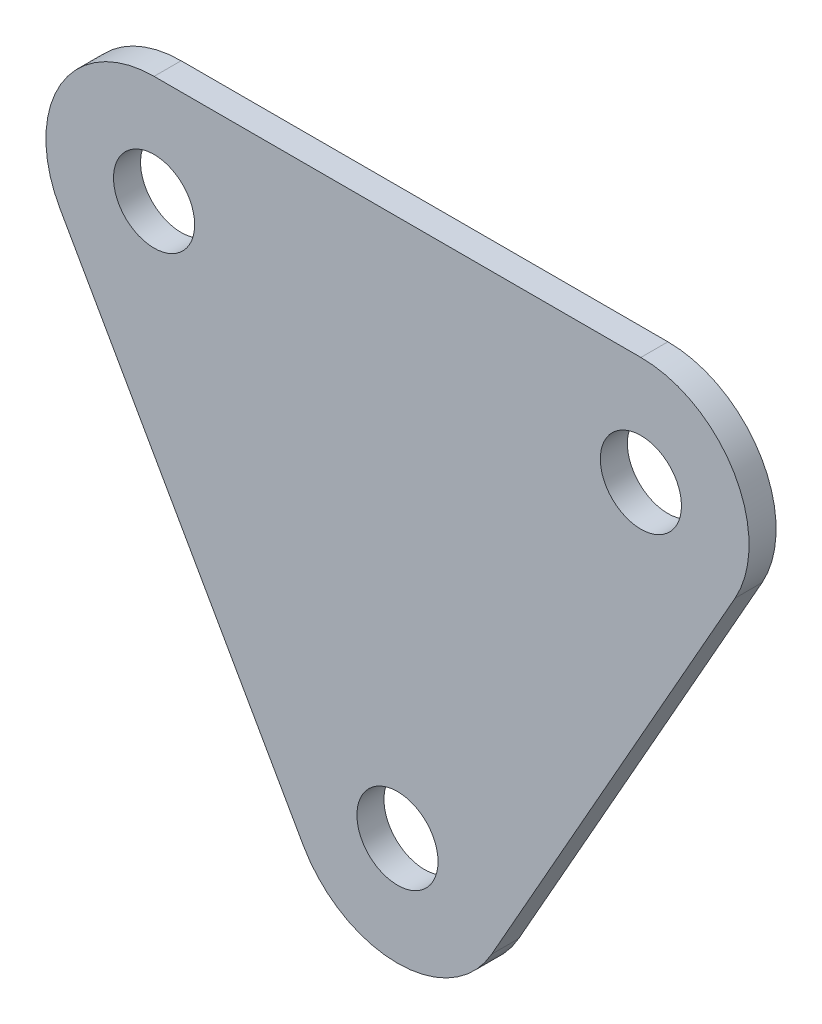
ISO-10303-21;
HEADER;
FILE_DESCRIPTION(('STEP AP214'),'2;1');
FILE_NAME('part.step','',(''),(''),'','','');
FILE_SCHEMA(('AUTOMOTIVE_DESIGN { 1 0 10303 214 1 1 1 1 }'));
ENDSEC;
DATA;
#1=APPLICATION_CONTEXT('core data for automotive mechanical design processes');
#2=APPLICATION_PROTOCOL_DEFINITION('international standard','automotive_design',2000,#1);
#3=PRODUCT_CONTEXT('',#1,'mechanical');
#4=PRODUCT('Part','Part','',(#3));
#5=PRODUCT_RELATED_PRODUCT_CATEGORY('part','',(#4));
#6=PRODUCT_DEFINITION_FORMATION('','',#4);
#7=PRODUCT_DEFINITION_CONTEXT('part definition',#1,'design');
#8=PRODUCT_DEFINITION('design','',#6,#7);
#9=PRODUCT_DEFINITION_SHAPE('','',#8);
#10=(LENGTH_UNIT() NAMED_UNIT(*) SI_UNIT(.MILLI.,.METRE.));
#11=(NAMED_UNIT(*) PLANE_ANGLE_UNIT() SI_UNIT($,.RADIAN.));
#12=(NAMED_UNIT(*) SI_UNIT($,.STERADIAN.) SOLID_ANGLE_UNIT());
#13=UNCERTAINTY_MEASURE_WITH_UNIT(LENGTH_MEASURE(1.E-05),#10,'distance_accuracy_value','');
#14=(GEOMETRIC_REPRESENTATION_CONTEXT(3) GLOBAL_UNCERTAINTY_ASSIGNED_CONTEXT((#13)) GLOBAL_UNIT_ASSIGNED_CONTEXT((#10,
#11,#12)) REPRESENTATION_CONTEXT('',''));
#15=CARTESIAN_POINT('',(0.,0.,0.));
#16=DIRECTION('',(0.,0.,1.));
#17=DIRECTION('',(1.,0.,0.));
#18=AXIS2_PLACEMENT_3D('',#15,#16,#17);
#19=CARTESIAN_POINT('',(180.,-318.,20.));
#20=DIRECTION('',(0.,0.,1.));
#21=DIRECTION('',(1.,0.,0.));
#22=AXIS2_PLACEMENT_3D('',#19,#20,#21);
#23=PLANE('',#22);
#24=CARTESIAN_POINT('',(360.,0.,20.));
#25=DIRECTION('',(0.,0.,1.));
#26=DIRECTION('',(1.,0.,0.));
#27=AXIS2_PLACEMENT_3D('',#24,#25,#26);
#28=CIRCLE('',#27,30.);
#29=CARTESIAN_POINT('',(390.,0.,20.));
#30=VERTEX_POINT('',#29);
#31=EDGE_CURVE('E212',#30,#30,#28,.T.);
#32=ORIENTED_EDGE('',*,*,#31,.F.);
#33=EDGE_LOOP('',(#32));
#34=FACE_BOUND('',#33,.T.);
#35=CARTESIAN_POINT('',(180.,-318.,20.));
#36=DIRECTION('',(0.,0.,1.));
#37=DIRECTION('',(1.,0.,0.));
#38=AXIS2_PLACEMENT_3D('',#35,#36,#37);
#39=CIRCLE('',#38,80.);
#40=CARTESIAN_POINT('',(110.379451594283,-357.407857588142,20.));
#41=VERTEX_POINT('',#40);
#42=CARTESIAN_POINT('',(249.620548405717,-357.407857588142,20.));
#43=VERTEX_POINT('',#42);
#44=EDGE_CURVE('E149',#41,#43,#39,.T.);
#45=ORIENTED_EDGE('',*,*,#44,.T.);
#46=DIRECTION('',(0.49259821985177,0.87025685507146,0.));
#47=VECTOR('',#46,1.);
#48=CARTESIAN_POINT('',(249.620548405717,-357.407857588142,20.));
#49=LINE('',#48,#47);
#50=CARTESIAN_POINT('',(429.620548405717,-39.4078575881416,20.));
#51=VERTEX_POINT('',#50);
#52=EDGE_CURVE('E96',#43,#51,#49,.T.);
#53=ORIENTED_EDGE('',*,*,#52,.T.);
#54=CARTESIAN_POINT('',(360.,0.,20.));
#55=DIRECTION('',(0.,0.,1.));
#56=DIRECTION('',(1.,0.,0.));
#57=AXIS2_PLACEMENT_3D('',#54,#55,#56);
#58=CIRCLE('',#57,80.);
#59=CARTESIAN_POINT('',(360.,80.,20.));
#60=VERTEX_POINT('',#59);
#61=EDGE_CURVE('E109',#51,#60,#58,.T.);
#62=ORIENTED_EDGE('',*,*,#61,.T.);
#63=DIRECTION('',(-1.,0.,0.));
#64=VECTOR('',#63,1.);
#65=CARTESIAN_POINT('',(0.,80.,20.));
#66=LINE('',#65,#64);
#67=CARTESIAN_POINT('',(0.,80.,20.));
#68=VERTEX_POINT('',#67);
#69=EDGE_CURVE('E103',#60,#68,#66,.T.);
#70=ORIENTED_EDGE('',*,*,#69,.T.);
#71=CARTESIAN_POINT('',(0.,0.,20.));
#72=DIRECTION('',(0.,0.,1.));
#73=DIRECTION('',(1.,0.,0.));
#74=AXIS2_PLACEMENT_3D('',#71,#72,#73);
#75=CIRCLE('',#74,80.);
#76=CARTESIAN_POINT('',(-69.6205484057168,-39.4078575881416,20.));
#77=VERTEX_POINT('',#76);
#78=EDGE_CURVE('E107',#68,#77,#75,.T.);
#79=ORIENTED_EDGE('',*,*,#78,.T.);
#80=DIRECTION('',(0.49259821985177,-0.87025685507146,0.));
#81=VECTOR('',#80,1.);
#82=CARTESIAN_POINT('',(110.379451594283,-357.407857588142,20.));
#83=LINE('',#82,#81);
#84=EDGE_CURVE('E59',#77,#41,#83,.T.);
#85=ORIENTED_EDGE('',*,*,#84,.T.);
#86=EDGE_LOOP('',(#45,#53,#62,#70,#79,#85));
#87=FACE_BOUND('',#86,.T.);
#88=CARTESIAN_POINT('',(0.,0.,20.));
#89=DIRECTION('',(0.,0.,1.));
#90=DIRECTION('',(1.,0.,0.));
#91=AXIS2_PLACEMENT_3D('',#88,#89,#90);
#92=CIRCLE('',#91,30.);
#93=CARTESIAN_POINT('',(30.,0.,20.));
#94=VERTEX_POINT('',#93);
#95=EDGE_CURVE('E137',#94,#94,#92,.T.);
#96=ORIENTED_EDGE('',*,*,#95,.F.);
#97=EDGE_LOOP('',(#96));
#98=FACE_BOUND('',#97,.T.);
#99=CARTESIAN_POINT('',(180.,-318.,20.));
#100=DIRECTION('',(0.,0.,1.));
#101=DIRECTION('',(1.,0.,0.));
#102=AXIS2_PLACEMENT_3D('',#99,#100,#101);
#103=CIRCLE('',#102,30.);
#104=CARTESIAN_POINT('',(210.,-318.,20.));
#105=VERTEX_POINT('',#104);
#106=EDGE_CURVE('E200',#105,#105,#103,.T.);
#107=ORIENTED_EDGE('',*,*,#106,.F.);
#108=EDGE_LOOP('',(#107));
#109=FACE_BOUND('',#108,.T.);
#110=ADVANCED_FACE('F41',(#34,#87,#98,#109),#23,.T.);
#111=CARTESIAN_POINT('',(180.,-318.,0.));
#112=DIRECTION('',(0.,0.,1.));
#113=DIRECTION('',(1.,0.,0.));
#114=AXIS2_PLACEMENT_3D('',#111,#112,#113);
#115=PLANE('',#114);
#116=CARTESIAN_POINT('',(180.,-318.,0.));
#117=DIRECTION('',(0.,0.,1.));
#118=DIRECTION('',(1.,0.,0.));
#119=AXIS2_PLACEMENT_3D('',#116,#117,#118);
#120=CIRCLE('',#119,80.);
#121=CARTESIAN_POINT('',(110.379451594283,-357.407857588142,0.));
#122=VERTEX_POINT('',#121);
#123=CARTESIAN_POINT('',(249.620548405717,-357.407857588142,0.));
#124=VERTEX_POINT('',#123);
#125=EDGE_CURVE('E132',#122,#124,#120,.T.);
#126=ORIENTED_EDGE('',*,*,#125,.F.);
#127=DIRECTION('',(0.49259821985177,-0.87025685507146,0.));
#128=VECTOR('',#127,1.);
#129=CARTESIAN_POINT('',(110.379451594283,-357.407857588142,0.));
#130=LINE('',#129,#128);
#131=CARTESIAN_POINT('',(-69.6205484057168,-39.4078575881416,0.));
#132=VERTEX_POINT('',#131);
#133=EDGE_CURVE('E88',#132,#122,#130,.T.);
#134=ORIENTED_EDGE('',*,*,#133,.F.);
#135=CARTESIAN_POINT('',(0.,0.,0.));
#136=DIRECTION('',(0.,0.,1.));
#137=DIRECTION('',(1.,0.,0.));
#138=AXIS2_PLACEMENT_3D('',#135,#136,#137);
#139=CIRCLE('',#138,80.);
#140=CARTESIAN_POINT('',(0.,80.,0.));
#141=VERTEX_POINT('',#140);
#142=EDGE_CURVE('E82',#141,#132,#139,.T.);
#143=ORIENTED_EDGE('',*,*,#142,.F.);
#144=DIRECTION('',(-1.,0.,0.));
#145=VECTOR('',#144,1.);
#146=CARTESIAN_POINT('',(0.,80.,0.));
#147=LINE('',#146,#145);
#148=CARTESIAN_POINT('',(360.,80.,0.));
#149=VERTEX_POINT('',#148);
#150=EDGE_CURVE('E118',#149,#141,#147,.T.);
#151=ORIENTED_EDGE('',*,*,#150,.F.);
#152=CARTESIAN_POINT('',(360.,0.,0.));
#153=DIRECTION('',(0.,0.,1.));
#154=DIRECTION('',(1.,0.,0.));
#155=AXIS2_PLACEMENT_3D('',#152,#153,#154);
#156=CIRCLE('',#155,80.);
#157=CARTESIAN_POINT('',(429.620548405717,-39.4078575881416,0.));
#158=VERTEX_POINT('',#157);
#159=EDGE_CURVE('E140',#158,#149,#156,.T.);
#160=ORIENTED_EDGE('',*,*,#159,.F.);
#161=DIRECTION('',(0.49259821985177,0.87025685507146,0.));
#162=VECTOR('',#161,1.);
#163=CARTESIAN_POINT('',(249.620548405717,-357.407857588142,0.));
#164=LINE('',#163,#162);
#165=EDGE_CURVE('E136',#124,#158,#164,.T.);
#166=ORIENTED_EDGE('',*,*,#165,.F.);
#167=EDGE_LOOP('',(#126,#134,#143,#151,#160,#166));
#168=FACE_BOUND('',#167,.T.);
#169=CARTESIAN_POINT('',(0.,0.,0.));
#170=DIRECTION('',(0.,0.,1.));
#171=DIRECTION('',(1.,0.,0.));
#172=AXIS2_PLACEMENT_3D('',#169,#170,#171);
#173=CIRCLE('',#172,30.);
#174=CARTESIAN_POINT('',(30.,0.,0.));
#175=VERTEX_POINT('',#174);
#176=EDGE_CURVE('E216',#175,#175,#173,.T.);
#177=ORIENTED_EDGE('',*,*,#176,.T.);
#178=EDGE_LOOP('',(#177));
#179=FACE_BOUND('',#178,.T.);
#180=CARTESIAN_POINT('',(360.,0.,0.));
#181=DIRECTION('',(0.,0.,1.));
#182=DIRECTION('',(1.,0.,0.));
#183=AXIS2_PLACEMENT_3D('',#180,#181,#182);
#184=CIRCLE('',#183,30.);
#185=CARTESIAN_POINT('',(390.,0.,0.));
#186=VERTEX_POINT('',#185);
#187=EDGE_CURVE('E209',#186,#186,#184,.T.);
#188=ORIENTED_EDGE('',*,*,#187,.T.);
#189=EDGE_LOOP('',(#188));
#190=FACE_BOUND('',#189,.T.);
#191=CARTESIAN_POINT('',(180.,-318.,0.));
#192=DIRECTION('',(0.,0.,1.));
#193=DIRECTION('',(1.,0.,0.));
#194=AXIS2_PLACEMENT_3D('',#191,#192,#193);
#195=CIRCLE('',#194,30.);
#196=CARTESIAN_POINT('',(210.,-318.,0.));
#197=VERTEX_POINT('',#196);
#198=EDGE_CURVE('E203',#197,#197,#195,.T.);
#199=ORIENTED_EDGE('',*,*,#198,.T.);
#200=EDGE_LOOP('',(#199));
#201=FACE_BOUND('',#200,.T.);
#202=ADVANCED_FACE('F163',(#168,#179,#190,#201),#115,.F.);
#203=CARTESIAN_POINT('',(180.,-318.,20.));
#204=DIRECTION('',(0.,0.,-1.));
#205=DIRECTION('',(-1.,0.,0.));
#206=AXIS2_PLACEMENT_3D('',#203,#204,#205);
#207=CYLINDRICAL_SURFACE('',#206,80.);
#208=ORIENTED_EDGE('',*,*,#125,.T.);
#209=DIRECTION('',(0.,0.,-1.));
#210=VECTOR('',#209,1.);
#211=CARTESIAN_POINT('',(249.620548405717,-357.407857588142,20.));
#212=LINE('',#211,#210);
#213=EDGE_CURVE('E11',#43,#124,#212,.T.);
#214=ORIENTED_EDGE('',*,*,#213,.F.);
#215=ORIENTED_EDGE('',*,*,#44,.F.);
#216=DIRECTION('',(0.,0.,-1.));
#217=VECTOR('',#216,1.);
#218=CARTESIAN_POINT('',(110.379451594283,-357.407857588142,20.));
#219=LINE('',#218,#217);
#220=EDGE_CURVE('E128',#41,#122,#219,.T.);
#221=ORIENTED_EDGE('',*,*,#220,.T.);
#222=EDGE_LOOP('',(#208,#214,#215,#221));
#223=FACE_BOUND('',#222,.T.);
#224=ADVANCED_FACE('F43',(#223),#207,.T.);
#225=CARTESIAN_POINT('',(249.620548405717,-357.407857588142,20.));
#226=DIRECTION('',(-0.87025685507146,0.49259821985177,0.));
#227=DIRECTION('',(-0.49259821985177,-0.87025685507146,0.));
#228=AXIS2_PLACEMENT_3D('',#225,#226,#227);
#229=PLANE('',#228);
#230=ORIENTED_EDGE('',*,*,#165,.T.);
#231=DIRECTION('',(0.,0.,-1.));
#232=VECTOR('',#231,1.);
#233=CARTESIAN_POINT('',(429.620548405717,-39.4078575881416,20.));
#234=LINE('',#233,#232);
#235=EDGE_CURVE('E51',#51,#158,#234,.T.);
#236=ORIENTED_EDGE('',*,*,#235,.F.);
#237=ORIENTED_EDGE('',*,*,#52,.F.);
#238=ORIENTED_EDGE('',*,*,#213,.T.);
#239=EDGE_LOOP('',(#230,#236,#237,#238));
#240=FACE_BOUND('',#239,.T.);
#241=ADVANCED_FACE('F287',(#240),#229,.F.);
#242=CARTESIAN_POINT('',(360.,0.,20.));
#243=DIRECTION('',(0.,0.,-1.));
#244=DIRECTION('',(-1.,0.,0.));
#245=AXIS2_PLACEMENT_3D('',#242,#243,#244);
#246=CYLINDRICAL_SURFACE('',#245,80.);
#247=ORIENTED_EDGE('',*,*,#159,.T.);
#248=DIRECTION('',(0.,0.,-1.));
#249=VECTOR('',#248,1.);
#250=CARTESIAN_POINT('',(360.,80.,20.));
#251=LINE('',#250,#249);
#252=EDGE_CURVE('E120',#60,#149,#251,.T.);
#253=ORIENTED_EDGE('',*,*,#252,.F.);
#254=ORIENTED_EDGE('',*,*,#61,.F.);
#255=ORIENTED_EDGE('',*,*,#235,.T.);
#256=EDGE_LOOP('',(#247,#253,#254,#255));
#257=FACE_BOUND('',#256,.T.);
#258=ADVANCED_FACE('F160',(#257),#246,.T.);
#259=CARTESIAN_POINT('',(0.,80.,20.));
#260=DIRECTION('',(0.,-1.,0.));
#261=DIRECTION('',(1.,0.,0.));
#262=AXIS2_PLACEMENT_3D('',#259,#260,#261);
#263=PLANE('',#262);
#264=ORIENTED_EDGE('',*,*,#150,.T.);
#265=DIRECTION('',(0.,0.,-1.));
#266=VECTOR('',#265,1.);
#267=CARTESIAN_POINT('',(0.,80.,20.));
#268=LINE('',#267,#266);
#269=EDGE_CURVE('E115',#68,#141,#268,.T.);
#270=ORIENTED_EDGE('',*,*,#269,.F.);
#271=ORIENTED_EDGE('',*,*,#69,.F.);
#272=ORIENTED_EDGE('',*,*,#252,.T.);
#273=EDGE_LOOP('',(#264,#270,#271,#272));
#274=FACE_BOUND('',#273,.T.);
#275=ADVANCED_FACE('F116',(#274),#263,.F.);
#276=CARTESIAN_POINT('',(0.,0.,20.));
#277=DIRECTION('',(0.,0.,-1.));
#278=DIRECTION('',(-1.,0.,0.));
#279=AXIS2_PLACEMENT_3D('',#276,#277,#278);
#280=CYLINDRICAL_SURFACE('',#279,80.);
#281=ORIENTED_EDGE('',*,*,#142,.T.);
#282=DIRECTION('',(0.,0.,-1.));
#283=VECTOR('',#282,1.);
#284=CARTESIAN_POINT('',(-69.6205484057168,-39.4078575881416,20.));
#285=LINE('',#284,#283);
#286=EDGE_CURVE('E121',#77,#132,#285,.T.);
#287=ORIENTED_EDGE('',*,*,#286,.F.);
#288=ORIENTED_EDGE('',*,*,#78,.F.);
#289=ORIENTED_EDGE('',*,*,#269,.T.);
#290=EDGE_LOOP('',(#281,#287,#288,#289));
#291=FACE_BOUND('',#290,.T.);
#292=ADVANCED_FACE('F123',(#291),#280,.T.);
#293=CARTESIAN_POINT('',(110.379451594283,-357.407857588142,20.));
#294=DIRECTION('',(0.87025685507146,0.49259821985177,0.));
#295=DIRECTION('',(-0.49259821985177,0.87025685507146,0.));
#296=AXIS2_PLACEMENT_3D('',#293,#294,#295);
#297=PLANE('',#296);
#298=ORIENTED_EDGE('',*,*,#133,.T.);
#299=ORIENTED_EDGE('',*,*,#220,.F.);
#300=ORIENTED_EDGE('',*,*,#84,.F.);
#301=ORIENTED_EDGE('',*,*,#286,.T.);
#302=EDGE_LOOP('',(#298,#299,#300,#301));
#303=FACE_BOUND('',#302,.T.);
#304=ADVANCED_FACE('F168',(#303),#297,.F.);
#305=CARTESIAN_POINT('',(0.,0.,20.));
#306=DIRECTION('',(0.,0.,-1.));
#307=DIRECTION('',(-1.,0.,0.));
#308=AXIS2_PLACEMENT_3D('',#305,#306,#307);
#309=CYLINDRICAL_SURFACE('',#308,30.);
#310=ORIENTED_EDGE('',*,*,#95,.T.);
#311=EDGE_LOOP('',(#310));
#312=FACE_BOUND('',#311,.T.);
#313=ORIENTED_EDGE('',*,*,#176,.F.);
#314=EDGE_LOOP('',(#313));
#315=FACE_BOUND('',#314,.T.);
#316=ADVANCED_FACE('F170',(#312,#315),#309,.F.);
#317=CARTESIAN_POINT('',(360.,0.,20.));
#318=DIRECTION('',(0.,0.,-1.));
#319=DIRECTION('',(-1.,0.,0.));
#320=AXIS2_PLACEMENT_3D('',#317,#318,#319);
#321=CYLINDRICAL_SURFACE('',#320,30.);
#322=ORIENTED_EDGE('',*,*,#31,.T.);
#323=EDGE_LOOP('',(#322));
#324=FACE_BOUND('',#323,.T.);
#325=ORIENTED_EDGE('',*,*,#187,.F.);
#326=EDGE_LOOP('',(#325));
#327=FACE_BOUND('',#326,.T.);
#328=ADVANCED_FACE('F176',(#324,#327),#321,.F.);
#329=CARTESIAN_POINT('',(180.,-318.,20.));
#330=DIRECTION('',(0.,0.,-1.));
#331=DIRECTION('',(-1.,0.,0.));
#332=AXIS2_PLACEMENT_3D('',#329,#330,#331);
#333=CYLINDRICAL_SURFACE('',#332,30.);
#334=ORIENTED_EDGE('',*,*,#106,.T.);
#335=EDGE_LOOP('',(#334));
#336=FACE_BOUND('',#335,.T.);
#337=ORIENTED_EDGE('',*,*,#198,.F.);
#338=EDGE_LOOP('',(#337));
#339=FACE_BOUND('',#338,.T.);
#340=ADVANCED_FACE('F191',(#336,#339),#333,.F.);
#341=CLOSED_SHELL('',(#110,#202,#224,#241,#258,#275,#292,#304,#316,#328,#340));
#342=MANIFOLD_SOLID_BREP('B2',#341);
#343=ADVANCED_BREP_SHAPE_REPRESENTATION('',(#18,#342),#14);
#344=SHAPE_DEFINITION_REPRESENTATION(#9,#343);
ENDSEC;
END-ISO-10303-21;
